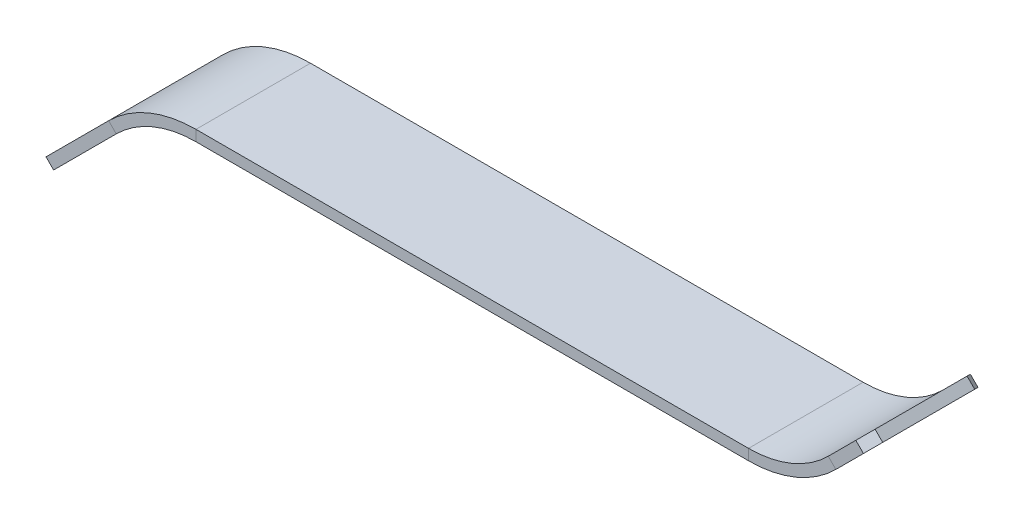
ISO-10303-21;
HEADER;
FILE_DESCRIPTION(('STEP AP214'),'2;1');
FILE_NAME('part.step','',(''),(''),'','','');
FILE_SCHEMA(('AUTOMOTIVE_DESIGN { 1 0 10303 214 1 1 1 1 }'));
ENDSEC;
DATA;
#1=APPLICATION_CONTEXT('core data for automotive mechanical design processes');
#2=APPLICATION_PROTOCOL_DEFINITION('international standard','automotive_design',2000,#1);
#3=PRODUCT_CONTEXT('',#1,'mechanical');
#4=PRODUCT('Part','Part','',(#3));
#5=PRODUCT_RELATED_PRODUCT_CATEGORY('part','',(#4));
#6=PRODUCT_DEFINITION_FORMATION('','',#4);
#7=PRODUCT_DEFINITION_CONTEXT('part definition',#1,'design');
#8=PRODUCT_DEFINITION('design','',#6,#7);
#9=PRODUCT_DEFINITION_SHAPE('','',#8);
#10=(LENGTH_UNIT() NAMED_UNIT(*) SI_UNIT(.MILLI.,.METRE.));
#11=(NAMED_UNIT(*) PLANE_ANGLE_UNIT() SI_UNIT($,.RADIAN.));
#12=(NAMED_UNIT(*) SI_UNIT($,.STERADIAN.) SOLID_ANGLE_UNIT());
#13=UNCERTAINTY_MEASURE_WITH_UNIT(LENGTH_MEASURE(1.E-05),#10,'distance_accuracy_value','');
#14=(GEOMETRIC_REPRESENTATION_CONTEXT(3) GLOBAL_UNCERTAINTY_ASSIGNED_CONTEXT((#13)) GLOBAL_UNIT_ASSIGNED_CONTEXT((#10,
#11,#12)) REPRESENTATION_CONTEXT('',''));
#15=CARTESIAN_POINT('',(0.,0.,0.));
#16=DIRECTION('',(0.,0.,1.));
#17=DIRECTION('',(1.,0.,0.));
#18=AXIS2_PLACEMENT_3D('',#15,#16,#17);
#19=CARTESIAN_POINT('',(-28.5953982311841,-40.1353390593272,-10.8));
#20=DIRECTION('',(-0.707106781186544,0.707106781186551,0.));
#21=DIRECTION('',(-0.707106781186551,-0.707106781186544,0.));
#22=AXIS2_PLACEMENT_3D('',#19,#20,#21);
#23=CYLINDRICAL_SURFACE('',#22,1.5);
#24=CARTESIAN_POINT('',(-28.5953982311841,-40.1353390593272,-10.8));
#25=DIRECTION('',(-0.707106781186544,0.707106781186551,0.));
#26=DIRECTION('',(-0.707106781186551,-0.707106781186544,0.));
#27=AXIS2_PLACEMENT_3D('',#24,#25,#26);
#28=CIRCLE('',#27,1.5);
#29=CARTESIAN_POINT('',(-29.656058402964,-41.195999231107,-10.8));
#30=VERTEX_POINT('',#29);
#31=EDGE_CURVE('E92',#30,#30,#28,.T.);
#32=ORIENTED_EDGE('',*,*,#31,.F.);
#33=EDGE_LOOP('',(#32));
#34=FACE_BOUND('',#33,.T.);
#35=CARTESIAN_POINT('',(-31.9753686452558,-36.7553686452555,-10.8));
#36=DIRECTION('',(-0.707106781186544,0.707106781186551,0.));
#37=DIRECTION('',(-0.707106781186551,-0.707106781186544,0.));
#38=AXIS2_PLACEMENT_3D('',#35,#36,#37);
#39=CIRCLE('',#38,1.5);
#40=CARTESIAN_POINT('',(-33.0360288170356,-37.8160288170353,-10.8));
#41=VERTEX_POINT('',#40);
#42=EDGE_CURVE('E13',#41,#41,#39,.T.);
#43=ORIENTED_EDGE('',*,*,#42,.T.);
#44=EDGE_LOOP('',(#43));
#45=FACE_BOUND('',#44,.T.);
#46=ADVANCED_FACE('F85',(#34,#45),#23,.F.);
#47=CARTESIAN_POINT('',(-10.9177287015203,-22.4576695296636,-10.8));
#48=DIRECTION('',(-0.707106781186544,0.707106781186551,0.));
#49=DIRECTION('',(-0.707106781186551,-0.707106781186544,0.));
#50=AXIS2_PLACEMENT_3D('',#47,#48,#49);
#51=CYLINDRICAL_SURFACE('',#50,1.5);
#52=CARTESIAN_POINT('',(-10.9177287015203,-22.4576695296636,-10.8));
#53=DIRECTION('',(-0.707106781186544,0.707106781186551,0.));
#54=DIRECTION('',(-0.707106781186551,-0.707106781186544,0.));
#55=AXIS2_PLACEMENT_3D('',#52,#53,#54);
#56=CIRCLE('',#55,1.5);
#57=CARTESIAN_POINT('',(-11.9783888733002,-23.5183297014434,-10.8));
#58=VERTEX_POINT('',#57);
#59=EDGE_CURVE('E327',#58,#58,#56,.T.);
#60=ORIENTED_EDGE('',*,*,#59,.F.);
#61=EDGE_LOOP('',(#60));
#62=FACE_BOUND('',#61,.T.);
#63=CARTESIAN_POINT('',(-14.297699115592,-19.0776991155919,-10.8));
#64=DIRECTION('',(-0.707106781186544,0.707106781186551,0.));
#65=DIRECTION('',(-0.707106781186551,-0.707106781186544,0.));
#66=AXIS2_PLACEMENT_3D('',#63,#64,#65);
#67=CIRCLE('',#66,1.5);
#68=CARTESIAN_POINT('',(-15.3583592873718,-20.1383592873717,-10.8));
#69=VERTEX_POINT('',#68);
#70=EDGE_CURVE('E330',#69,#69,#67,.T.);
#71=ORIENTED_EDGE('',*,*,#70,.T.);
#72=EDGE_LOOP('',(#71));
#73=FACE_BOUND('',#72,.T.);
#74=ADVANCED_FACE('F339',(#62,#73),#51,.F.);
#75=CARTESIAN_POINT('',(0.,-4.78,-50.8));
#76=DIRECTION('',(0.,0.,1.));
#77=DIRECTION('',(1.,0.,0.));
#78=AXIS2_PLACEMENT_3D('',#75,#76,#77);
#79=PLANE('',#78);
#80=DIRECTION('',(0.,1.,0.));
#81=VECTOR('',#80,1.);
#82=CARTESIAN_POINT('',(27.470618946798,-4.78,-50.8));
#83=LINE('',#82,#81);
#84=CARTESIAN_POINT('',(27.470618946798,-4.78,-50.8));
#85=VERTEX_POINT('',#84);
#86=CARTESIAN_POINT('',(27.470618946798,0.,-50.8));
#87=VERTEX_POINT('',#86);
#88=EDGE_CURVE('E238',#85,#87,#83,.T.);
#89=ORIENTED_EDGE('',*,*,#88,.T.);
#90=DIRECTION('',(1.,0.,0.));
#91=VECTOR('',#90,1.);
#92=CARTESIAN_POINT('',(0.,0.,-50.8));
#93=LINE('',#92,#91);
#94=CARTESIAN_POINT('',(272.529381053202,0.,-50.8));
#95=VERTEX_POINT('',#94);
#96=EDGE_CURVE('E301',#87,#95,#93,.T.);
#97=ORIENTED_EDGE('',*,*,#96,.T.);
#98=DIRECTION('',(0.,-1.,0.));
#99=VECTOR('',#98,1.);
#100=CARTESIAN_POINT('',(272.529381053202,0.,-50.8));
#101=LINE('',#100,#99);
#102=CARTESIAN_POINT('',(272.529381053202,-4.78,-50.8));
#103=VERTEX_POINT('',#102);
#104=EDGE_CURVE('E287',#95,#103,#101,.T.);
#105=ORIENTED_EDGE('',*,*,#104,.T.);
#106=DIRECTION('',(1.,0.,0.));
#107=VECTOR('',#106,1.);
#108=CARTESIAN_POINT('',(0.,-4.78,-50.8));
#109=LINE('',#108,#107);
#110=EDGE_CURVE('E304',#85,#103,#109,.T.);
#111=ORIENTED_EDGE('',*,*,#110,.F.);
#112=EDGE_LOOP('',(#89,#97,#105,#111));
#113=FACE_BOUND('',#112,.T.);
#114=ADVANCED_FACE('F420',(#113),#79,.F.);
#115=CARTESIAN_POINT('',(0.,-4.78,0.));
#116=DIRECTION('',(0.,1.,0.));
#117=DIRECTION('',(0.,0.,1.));
#118=AXIS2_PLACEMENT_3D('',#115,#116,#117);
#119=PLANE('',#118);
#120=DIRECTION('',(0.,0.,-1.));
#121=VECTOR('',#120,1.);
#122=CARTESIAN_POINT('',(27.470618946798,-4.78,-50.8));
#123=LINE('',#122,#121);
#124=CARTESIAN_POINT('',(27.470618946798,-4.78,0.));
#125=VERTEX_POINT('',#124);
#126=EDGE_CURVE('E244',#85,#125,#123,.F.);
#127=ORIENTED_EDGE('',*,*,#126,.F.);
#128=ORIENTED_EDGE('',*,*,#110,.T.);
#129=DIRECTION('',(0.,0.,-1.));
#130=VECTOR('',#129,1.);
#131=CARTESIAN_POINT('',(272.529381053202,-4.78,-50.8));
#132=LINE('',#131,#130);
#133=CARTESIAN_POINT('',(272.529381053202,-4.78,0.));
#134=VERTEX_POINT('',#133);
#135=EDGE_CURVE('E280',#103,#134,#132,.F.);
#136=ORIENTED_EDGE('',*,*,#135,.T.);
#137=DIRECTION('',(1.,0.,0.));
#138=VECTOR('',#137,1.);
#139=CARTESIAN_POINT('',(0.,-4.78,0.));
#140=LINE('',#139,#138);
#141=EDGE_CURVE('E306',#125,#134,#140,.T.);
#142=ORIENTED_EDGE('',*,*,#141,.F.);
#143=EDGE_LOOP('',(#127,#128,#136,#142));
#144=FACE_BOUND('',#143,.T.);
#145=ADVANCED_FACE('F416',(#144),#119,.F.);
#146=CARTESIAN_POINT('',(0.,0.,0.));
#147=DIRECTION('',(0.,1.,0.));
#148=DIRECTION('',(0.,0.,1.));
#149=AXIS2_PLACEMENT_3D('',#146,#147,#148);
#150=PLANE('',#149);
#151=ORIENTED_EDGE('',*,*,#96,.F.);
#152=DIRECTION('',(0.,0.,-1.));
#153=VECTOR('',#152,1.);
#154=CARTESIAN_POINT('',(27.470618946798,0.,-50.8));
#155=LINE('',#154,#153);
#156=CARTESIAN_POINT('',(27.470618946798,0.,0.));
#157=VERTEX_POINT('',#156);
#158=EDGE_CURVE('E231',#87,#157,#155,.F.);
#159=ORIENTED_EDGE('',*,*,#158,.T.);
#160=DIRECTION('',(1.,0.,0.));
#161=VECTOR('',#160,1.);
#162=CARTESIAN_POINT('',(0.,0.,0.));
#163=LINE('',#162,#161);
#164=CARTESIAN_POINT('',(272.529381053202,0.,0.));
#165=VERTEX_POINT('',#164);
#166=EDGE_CURVE('E307',#157,#165,#163,.T.);
#167=ORIENTED_EDGE('',*,*,#166,.T.);
#168=DIRECTION('',(0.,0.,-1.));
#169=VECTOR('',#168,1.);
#170=CARTESIAN_POINT('',(272.529381053202,0.,-50.8));
#171=LINE('',#170,#169);
#172=EDGE_CURVE('E293',#95,#165,#171,.F.);
#173=ORIENTED_EDGE('',*,*,#172,.F.);
#174=EDGE_LOOP('',(#151,#159,#167,#173));
#175=FACE_BOUND('',#174,.T.);
#176=ADVANCED_FACE('F419',(#175),#150,.T.);
#177=CARTESIAN_POINT('',(0.,-4.78,0.));
#178=DIRECTION('',(0.,0.,1.));
#179=DIRECTION('',(1.,0.,0.));
#180=AXIS2_PLACEMENT_3D('',#177,#178,#179);
#181=PLANE('',#180);
#182=DIRECTION('',(0.,1.,0.));
#183=VECTOR('',#182,1.);
#184=CARTESIAN_POINT('',(27.470618946798,-4.78,0.));
#185=LINE('',#184,#183);
#186=EDGE_CURVE('E249',#125,#157,#185,.T.);
#187=ORIENTED_EDGE('',*,*,#186,.F.);
#188=ORIENTED_EDGE('',*,*,#141,.T.);
#189=DIRECTION('',(0.,-1.,0.));
#190=VECTOR('',#189,1.);
#191=CARTESIAN_POINT('',(272.529381053202,0.,0.));
#192=LINE('',#191,#190);
#193=EDGE_CURVE('E298',#165,#134,#192,.T.);
#194=ORIENTED_EDGE('',*,*,#193,.F.);
#195=ORIENTED_EDGE('',*,*,#166,.F.);
#196=EDGE_LOOP('',(#187,#188,#194,#195));
#197=FACE_BOUND('',#196,.T.);
#198=ADVANCED_FACE('F411',(#197),#181,.T.);
#199=CARTESIAN_POINT('',(272.529381053202,50.,0.));
#200=DIRECTION('',(0.,0.,1.));
#201=DIRECTION('',(1.,0.,0.));
#202=AXIS2_PLACEMENT_3D('',#199,#200,#201);
#203=PLANE('',#202);
#204=DIRECTION('',(-0.707106781186544,0.707106781186551,0.));
#205=VECTOR('',#204,1.);
#206=CARTESIAN_POINT('',(311.264690526601,11.2646905266007,0.));
#207=LINE('',#206,#205);
#208=CARTESIAN_POINT('',(307.884720112529,14.6446609406724,0.));
#209=VERTEX_POINT('',#208);
#210=CARTESIAN_POINT('',(311.264690526601,11.2646905266007,0.));
#211=VERTEX_POINT('',#210);
#212=EDGE_CURVE('E252',#209,#211,#207,.F.);
#213=ORIENTED_EDGE('',*,*,#212,.F.);
#214=CARTESIAN_POINT('',(272.529381053202,50.,0.));
#215=DIRECTION('',(0.,0.,-1.));
#216=DIRECTION('',(-1.,0.,0.));
#217=AXIS2_PLACEMENT_3D('',#214,#215,#216);
#218=CIRCLE('',#217,50.);
#219=EDGE_CURVE('E290',#165,#209,#218,.F.);
#220=ORIENTED_EDGE('',*,*,#219,.F.);
#221=ORIENTED_EDGE('',*,*,#193,.T.);
#222=CARTESIAN_POINT('',(272.529381053202,50.,0.));
#223=DIRECTION('',(0.,0.,-1.));
#224=DIRECTION('',(-1.,0.,0.));
#225=AXIS2_PLACEMENT_3D('',#222,#223,#224);
#226=CIRCLE('',#225,54.78);
#227=EDGE_CURVE('E283',#134,#211,#226,.F.);
#228=ORIENTED_EDGE('',*,*,#227,.T.);
#229=EDGE_LOOP('',(#213,#220,#221,#228));
#230=FACE_BOUND('',#229,.T.);
#231=ADVANCED_FACE('F408',(#230),#203,.T.);
#232=CARTESIAN_POINT('',(272.529381053202,50.,-50.8));
#233=DIRECTION('',(0.,0.,1.));
#234=DIRECTION('',(1.,0.,0.));
#235=AXIS2_PLACEMENT_3D('',#232,#233,#234);
#236=PLANE('',#235);
#237=CARTESIAN_POINT('',(272.529381053202,50.,-50.8));
#238=DIRECTION('',(0.,0.,-1.));
#239=DIRECTION('',(-1.,0.,0.));
#240=AXIS2_PLACEMENT_3D('',#237,#238,#239);
#241=CIRCLE('',#240,50.);
#242=CARTESIAN_POINT('',(307.884720112529,14.6446609406724,-50.8));
#243=VERTEX_POINT('',#242);
#244=EDGE_CURVE('E257',#243,#95,#241,.T.);
#245=ORIENTED_EDGE('',*,*,#244,.F.);
#246=DIRECTION('',(-0.707106781186544,0.707106781186551,0.));
#247=VECTOR('',#246,1.);
#248=CARTESIAN_POINT('',(307.884720112529,14.6446609406725,-50.8));
#249=LINE('',#248,#247);
#250=CARTESIAN_POINT('',(311.264690526601,11.2646905266008,-50.8));
#251=VERTEX_POINT('',#250);
#252=EDGE_CURVE('E273',#243,#251,#249,.F.);
#253=ORIENTED_EDGE('',*,*,#252,.T.);
#254=CARTESIAN_POINT('',(272.529381053202,50.,-50.8));
#255=DIRECTION('',(0.,0.,-1.));
#256=DIRECTION('',(-1.,0.,0.));
#257=AXIS2_PLACEMENT_3D('',#254,#255,#256);
#258=CIRCLE('',#257,54.78);
#259=EDGE_CURVE('E284',#251,#103,#258,.T.);
#260=ORIENTED_EDGE('',*,*,#259,.T.);
#261=ORIENTED_EDGE('',*,*,#104,.F.);
#262=EDGE_LOOP('',(#245,#253,#260,#261));
#263=FACE_BOUND('',#262,.T.);
#264=ADVANCED_FACE('F403',(#263),#236,.F.);
#265=CARTESIAN_POINT('',(272.529381053202,50.,-50.8));
#266=DIRECTION('',(0.,0.,-1.));
#267=DIRECTION('',(0.707106781186544,-0.707106781186551,0.));
#268=AXIS2_PLACEMENT_3D('',#265,#266,#267);
#269=CYLINDRICAL_SURFACE('',#268,54.78);
#270=ORIENTED_EDGE('',*,*,#135,.F.);
#271=ORIENTED_EDGE('',*,*,#259,.F.);
#272=DIRECTION('',(0.,0.,-1.));
#273=VECTOR('',#272,1.);
#274=CARTESIAN_POINT('',(311.264690526601,11.2646905266008,0.));
#275=LINE('',#274,#273);
#276=EDGE_CURVE('E270',#251,#211,#275,.F.);
#277=ORIENTED_EDGE('',*,*,#276,.T.);
#278=ORIENTED_EDGE('',*,*,#227,.F.);
#279=EDGE_LOOP('',(#270,#271,#277,#278));
#280=FACE_BOUND('',#279,.T.);
#281=ADVANCED_FACE('F400',(#280),#269,.T.);
#282=CARTESIAN_POINT('',(272.529381053202,50.,-50.8));
#283=DIRECTION('',(0.,0.,-1.));
#284=DIRECTION('',(0.707106781186544,-0.707106781186551,0.));
#285=AXIS2_PLACEMENT_3D('',#282,#283,#284);
#286=CYLINDRICAL_SURFACE('',#285,50.);
#287=ORIENTED_EDGE('',*,*,#172,.T.);
#288=ORIENTED_EDGE('',*,*,#219,.T.);
#289=DIRECTION('',(0.,0.,-1.));
#290=VECTOR('',#289,1.);
#291=CARTESIAN_POINT('',(307.884720112529,14.6446609406725,0.));
#292=LINE('',#291,#290);
#293=EDGE_CURVE('E276',#209,#243,#292,.T.);
#294=ORIENTED_EDGE('',*,*,#293,.T.);
#295=ORIENTED_EDGE('',*,*,#244,.T.);
#296=EDGE_LOOP('',(#287,#288,#294,#295));
#297=FACE_BOUND('',#296,.T.);
#298=ADVANCED_FACE('F398',(#297),#286,.F.);
#299=CARTESIAN_POINT('',(296.620029585928,-3.37997041407172,0.));
#300=DIRECTION('',(0.,0.,-1.));
#301=DIRECTION('',(-1.,0.,0.));
#302=AXIS2_PLACEMENT_3D('',#299,#300,#301);
#303=PLANE('',#302);
#304=DIRECTION('',(-0.707106781186551,-0.707106781186544,0.));
#305=VECTOR('',#304,1.);
#306=CARTESIAN_POINT('',(146.620029585927,-153.379970414072,0.));
#307=LINE('',#306,#305);
#308=CARTESIAN_POINT('',(323.504271247462,23.5042712474618,0.));
#309=VERTEX_POINT('',#308);
#310=EDGE_CURVE('E261',#309,#211,#307,.T.);
#311=ORIENTED_EDGE('',*,*,#310,.F.);
#312=DIRECTION('',(-0.707106781186544,0.707106781186551,0.));
#313=VECTOR('',#312,1.);
#314=CARTESIAN_POINT('',(323.504271247462,23.5042712474617,0.));
#315=LINE('',#314,#313);
#316=CARTESIAN_POINT('',(320.12430083339,26.8842416615334,0.));
#317=VERTEX_POINT('',#316);
#318=EDGE_CURVE('E320',#309,#317,#315,.T.);
#319=ORIENTED_EDGE('',*,*,#318,.T.);
#320=DIRECTION('',(0.707106781186551,0.707106781186544,0.));
#321=VECTOR('',#320,1.);
#322=CARTESIAN_POINT('',(293.240059171857,0.,0.));
#323=LINE('',#322,#321);
#324=EDGE_CURVE('E268',#317,#209,#323,.F.);
#325=ORIENTED_EDGE('',*,*,#324,.T.);
#326=ORIENTED_EDGE('',*,*,#212,.T.);
#327=EDGE_LOOP('',(#311,#319,#325,#326));
#328=FACE_BOUND('',#327,.T.);
#329=ADVANCED_FACE('F394',(#328),#303,.F.);
#330=CARTESIAN_POINT('',(327.039805153395,27.0398051533945,-50.8));
#331=DIRECTION('',(0.,0.,1.));
#332=DIRECTION('',(1.,0.,0.));
#333=AXIS2_PLACEMENT_3D('',#330,#331,#332);
#334=PLANE('',#333);
#335=DIRECTION('',(-0.707106781186551,-0.707106781186544,0.));
#336=VECTOR('',#335,1.);
#337=CARTESIAN_POINT('',(323.659834739323,30.4197755674662,-50.8));
#338=LINE('',#337,#336);
#339=CARTESIAN_POINT('',(320.12430083339,26.8842416615335,-50.8));
#340=VERTEX_POINT('',#339);
#341=EDGE_CURVE('E265',#243,#340,#338,.F.);
#342=ORIENTED_EDGE('',*,*,#341,.T.);
#343=DIRECTION('',(0.707106781186544,-0.707106781186551,0.));
#344=VECTOR('',#343,1.);
#345=CARTESIAN_POINT('',(323.504271247462,23.5042712474617,-50.8));
#346=LINE('',#345,#344);
#347=CARTESIAN_POINT('',(323.504271247462,23.5042712474617,-50.8));
#348=VERTEX_POINT('',#347);
#349=EDGE_CURVE('E316',#340,#348,#346,.T.);
#350=ORIENTED_EDGE('',*,*,#349,.T.);
#351=DIRECTION('',(0.707106781186551,0.707106781186544,0.));
#352=VECTOR('',#351,1.);
#353=CARTESIAN_POINT('',(146.620029585927,-153.379970414072,-50.8));
#354=LINE('',#353,#352);
#355=EDGE_CURVE('E258',#251,#348,#354,.T.);
#356=ORIENTED_EDGE('',*,*,#355,.F.);
#357=ORIENTED_EDGE('',*,*,#252,.F.);
#358=EDGE_LOOP('',(#342,#350,#356,#357));
#359=FACE_BOUND('',#358,.T.);
#360=ADVANCED_FACE('F386',(#359),#334,.F.);
#361=CARTESIAN_POINT('',(146.620029585927,-153.379970414072,0.));
#362=DIRECTION('',(-0.707106781186544,0.707106781186551,0.));
#363=DIRECTION('',(-0.707106781186551,-0.707106781186544,0.));
#364=AXIS2_PLACEMENT_3D('',#361,#362,#363);
#365=PLANE('',#364);
#366=DIRECTION('',(0.,0.,1.));
#367=VECTOR('',#366,1.);
#368=CARTESIAN_POINT('',(327.039805153395,27.0398051533945,0.));
#369=LINE('',#368,#367);
#370=CARTESIAN_POINT('',(327.039805153395,27.0398051533945,-45.8));
#371=VERTEX_POINT('',#370);
#372=CARTESIAN_POINT('',(327.039805153395,27.0398051533945,-5.00000000000003));
#373=VERTEX_POINT('',#372);
#374=EDGE_CURVE('E255',#371,#373,#369,.T.);
#375=ORIENTED_EDGE('',*,*,#374,.T.);
#376=DIRECTION('',(0.500000000000004,0.499999999999999,-0.707106781186545));
#377=VECTOR('',#376,1.);
#378=CARTESIAN_POINT('',(323.504271247462,23.5042712474617,0.));
#379=LINE('',#378,#377);
#380=EDGE_CURVE('E325',#373,#309,#379,.F.);
#381=ORIENTED_EDGE('',*,*,#380,.T.);
#382=ORIENTED_EDGE('',*,*,#310,.T.);
#383=ORIENTED_EDGE('',*,*,#276,.F.);
#384=ORIENTED_EDGE('',*,*,#355,.T.);
#385=DIRECTION('',(-0.500000000000004,-0.499999999999999,-0.707106781186546));
#386=VECTOR('',#385,1.);
#387=CARTESIAN_POINT('',(327.039805153395,27.0398051533945,-45.8));
#388=LINE('',#387,#386);
#389=EDGE_CURVE('E318',#348,#371,#388,.F.);
#390=ORIENTED_EDGE('',*,*,#389,.T.);
#391=EDGE_LOOP('',(#375,#381,#382,#383,#384,#390));
#392=FACE_BOUND('',#391,.T.);
#393=ADVANCED_FACE('F382',(#392),#365,.F.);
#394=CARTESIAN_POINT('',(143.240059171855,-150.,0.));
#395=DIRECTION('',(-0.707106781186544,0.707106781186551,0.));
#396=DIRECTION('',(-0.707106781186551,-0.707106781186544,0.));
#397=AXIS2_PLACEMENT_3D('',#394,#395,#396);
#398=PLANE('',#397);
#399=ORIENTED_EDGE('',*,*,#324,.F.);
#400=DIRECTION('',(-0.500000000000004,-0.499999999999999,0.707106781186545));
#401=VECTOR('',#400,1.);
#402=CARTESIAN_POINT('',(231.682180002622,-61.5578791692339,125.076046763911));
#403=LINE('',#402,#401);
#404=CARTESIAN_POINT('',(323.659834739323,30.4197755674662,-5.00000000000003));
#405=VERTEX_POINT('',#404);
#406=EDGE_CURVE('E107',#317,#405,#403,.F.);
#407=ORIENTED_EDGE('',*,*,#406,.T.);
#408=DIRECTION('',(0.,0.,-1.));
#409=VECTOR('',#408,1.);
#410=CARTESIAN_POINT('',(323.659834739323,30.4197755674662,0.));
#411=LINE('',#410,#409);
#412=CARTESIAN_POINT('',(323.659834739323,30.4197755674662,-45.8));
#413=VERTEX_POINT('',#412);
#414=EDGE_CURVE('E263',#413,#405,#411,.F.);
#415=ORIENTED_EDGE('',*,*,#414,.F.);
#416=DIRECTION('',(0.500000000000004,0.499999999999999,0.707106781186546));
#417=VECTOR('',#416,1.);
#418=CARTESIAN_POINT('',(249.642692244761,-43.5973669270955,-150.476046763911));
#419=LINE('',#418,#417);
#420=EDGE_CURVE('E314',#413,#340,#419,.F.);
#421=ORIENTED_EDGE('',*,*,#420,.T.);
#422=ORIENTED_EDGE('',*,*,#341,.F.);
#423=ORIENTED_EDGE('',*,*,#293,.F.);
#424=EDGE_LOOP('',(#399,#407,#415,#421,#422,#423));
#425=FACE_BOUND('',#424,.T.);
#426=ADVANCED_FACE('F385',(#425),#398,.T.);
#427=CARTESIAN_POINT('',(327.039805153395,27.0398051533945,0.));
#428=DIRECTION('',(-0.707106781186551,-0.707106781186544,0.));
#429=DIRECTION('',(0.707106781186544,-0.707106781186551,0.));
#430=AXIS2_PLACEMENT_3D('',#427,#428,#429);
#431=PLANE('',#430);
#432=ORIENTED_EDGE('',*,*,#414,.T.);
#433=DIRECTION('',(0.707106781186544,-0.707106781186551,0.));
#434=VECTOR('',#433,1.);
#435=CARTESIAN_POINT('',(327.039805153395,27.0398051533945,-5.00000000000003));
#436=LINE('',#435,#434);
#437=EDGE_CURVE('E99',#405,#373,#436,.T.);
#438=ORIENTED_EDGE('',*,*,#437,.T.);
#439=ORIENTED_EDGE('',*,*,#374,.F.);
#440=DIRECTION('',(-0.707106781186544,0.707106781186551,0.));
#441=VECTOR('',#440,1.);
#442=CARTESIAN_POINT('',(327.039805153395,27.0398051533945,-45.8));
#443=LINE('',#442,#441);
#444=EDGE_CURVE('E309',#371,#413,#443,.T.);
#445=ORIENTED_EDGE('',*,*,#444,.T.);
#446=EDGE_LOOP('',(#432,#438,#439,#445));
#447=FACE_BOUND('',#446,.T.);
#448=ADVANCED_FACE('F377',(#447),#431,.F.);
#449=CARTESIAN_POINT('',(27.470618946798,-54.78,0.));
#450=DIRECTION('',(0.,0.,1.));
#451=DIRECTION('',(1.,0.,0.));
#452=AXIS2_PLACEMENT_3D('',#449,#450,#451);
#453=PLANE('',#452);
#454=DIRECTION('',(0.707106781186544,-0.707106781186551,0.));
#455=VECTOR('',#454,1.);
#456=CARTESIAN_POINT('',(-11.2646905266008,-16.0446905266007,0.));
#457=LINE('',#456,#455);
#458=CARTESIAN_POINT('',(-7.88472011252916,-19.4246609406724,0.));
#459=VERTEX_POINT('',#458);
#460=CARTESIAN_POINT('',(-11.2646905266008,-16.0446905266007,0.));
#461=VERTEX_POINT('',#460);
#462=EDGE_CURVE('E212',#459,#461,#457,.F.);
#463=ORIENTED_EDGE('',*,*,#462,.F.);
#464=CARTESIAN_POINT('',(27.470618946798,-54.78,0.));
#465=DIRECTION('',(0.,0.,-1.));
#466=DIRECTION('',(-1.,0.,0.));
#467=AXIS2_PLACEMENT_3D('',#464,#465,#466);
#468=CIRCLE('',#467,50.);
#469=EDGE_CURVE('E241',#125,#459,#468,.F.);
#470=ORIENTED_EDGE('',*,*,#469,.F.);
#471=ORIENTED_EDGE('',*,*,#186,.T.);
#472=CARTESIAN_POINT('',(27.470618946798,-54.78,0.));
#473=DIRECTION('',(0.,0.,-1.));
#474=DIRECTION('',(-1.,0.,0.));
#475=AXIS2_PLACEMENT_3D('',#472,#473,#474);
#476=CIRCLE('',#475,54.78);
#477=EDGE_CURVE('E234',#157,#461,#476,.F.);
#478=ORIENTED_EDGE('',*,*,#477,.T.);
#479=EDGE_LOOP('',(#463,#470,#471,#478));
#480=FACE_BOUND('',#479,.T.);
#481=ADVANCED_FACE('F374',(#480),#453,.T.);
#482=CARTESIAN_POINT('',(27.470618946798,-54.78,-50.8));
#483=DIRECTION('',(0.,0.,1.));
#484=DIRECTION('',(1.,0.,0.));
#485=AXIS2_PLACEMENT_3D('',#482,#483,#484);
#486=PLANE('',#485);
#487=CARTESIAN_POINT('',(27.470618946798,-54.78,-50.8));
#488=DIRECTION('',(0.,0.,-1.));
#489=DIRECTION('',(-1.,0.,0.));
#490=AXIS2_PLACEMENT_3D('',#487,#488,#489);
#491=CIRCLE('',#490,50.);
#492=CARTESIAN_POINT('',(-7.88472011252916,-19.4246609406724,-50.8));
#493=VERTEX_POINT('',#492);
#494=EDGE_CURVE('E246',#493,#85,#491,.T.);
#495=ORIENTED_EDGE('',*,*,#494,.F.);
#496=DIRECTION('',(0.707106781186544,-0.707106781186551,0.));
#497=VECTOR('',#496,1.);
#498=CARTESIAN_POINT('',(-7.88472011252916,-19.4246609406724,-50.8));
#499=LINE('',#498,#497);
#500=CARTESIAN_POINT('',(-11.2646905266008,-16.0446905266007,-50.8));
#501=VERTEX_POINT('',#500);
#502=EDGE_CURVE('E224',#493,#501,#499,.F.);
#503=ORIENTED_EDGE('',*,*,#502,.T.);
#504=CARTESIAN_POINT('',(27.470618946798,-54.78,-50.8));
#505=DIRECTION('',(0.,0.,-1.));
#506=DIRECTION('',(-1.,0.,0.));
#507=AXIS2_PLACEMENT_3D('',#504,#505,#506);
#508=CIRCLE('',#507,54.78);
#509=EDGE_CURVE('E235',#501,#87,#508,.T.);
#510=ORIENTED_EDGE('',*,*,#509,.T.);
#511=ORIENTED_EDGE('',*,*,#88,.F.);
#512=EDGE_LOOP('',(#495,#503,#510,#511));
#513=FACE_BOUND('',#512,.T.);
#514=ADVANCED_FACE('F369',(#513),#486,.F.);
#515=CARTESIAN_POINT('',(27.470618946798,-54.78,-50.8));
#516=DIRECTION('',(0.,0.,-1.));
#517=DIRECTION('',(-0.707106781186544,0.707106781186551,0.));
#518=AXIS2_PLACEMENT_3D('',#515,#516,#517);
#519=CYLINDRICAL_SURFACE('',#518,54.78);
#520=ORIENTED_EDGE('',*,*,#158,.F.);
#521=ORIENTED_EDGE('',*,*,#509,.F.);
#522=DIRECTION('',(0.,0.,-1.));
#523=VECTOR('',#522,1.);
#524=CARTESIAN_POINT('',(-11.2646905266008,-16.0446905266007,0.));
#525=LINE('',#524,#523);
#526=EDGE_CURVE('E222',#501,#461,#525,.F.);
#527=ORIENTED_EDGE('',*,*,#526,.T.);
#528=ORIENTED_EDGE('',*,*,#477,.F.);
#529=EDGE_LOOP('',(#520,#521,#527,#528));
#530=FACE_BOUND('',#529,.T.);
#531=ADVANCED_FACE('F366',(#530),#519,.T.);
#532=CARTESIAN_POINT('',(27.470618946798,-54.78,-50.8));
#533=DIRECTION('',(0.,0.,-1.));
#534=DIRECTION('',(-0.707106781186544,0.707106781186551,0.));
#535=AXIS2_PLACEMENT_3D('',#532,#533,#534);
#536=CYLINDRICAL_SURFACE('',#535,50.);
#537=ORIENTED_EDGE('',*,*,#126,.T.);
#538=ORIENTED_EDGE('',*,*,#469,.T.);
#539=DIRECTION('',(0.,0.,-1.));
#540=VECTOR('',#539,1.);
#541=CARTESIAN_POINT('',(-7.88472011252916,-19.4246609406724,0.));
#542=LINE('',#541,#540);
#543=EDGE_CURVE('E227',#459,#493,#542,.T.);
#544=ORIENTED_EDGE('',*,*,#543,.T.);
#545=ORIENTED_EDGE('',*,*,#494,.T.);
#546=EDGE_LOOP('',(#537,#538,#544,#545));
#547=FACE_BOUND('',#546,.T.);
#548=ADVANCED_FACE('F364',(#547),#536,.F.);
#549=CARTESIAN_POINT('',(-39.0464364571213,-43.8264364571209,-50.8));
#550=DIRECTION('',(0.,0.,1.));
#551=DIRECTION('',(1.,0.,0.));
#552=AXIS2_PLACEMENT_3D('',#549,#550,#551);
#553=PLANE('',#552);
#554=ORIENTED_EDGE('',*,*,#502,.F.);
#555=DIRECTION('',(0.707106781186551,0.707106781186544,0.));
#556=VECTOR('',#555,1.);
#557=CARTESIAN_POINT('',(-35.6664660430496,-47.2064068711926,-50.8));
#558=LINE('',#557,#556);
#559=CARTESIAN_POINT('',(-35.6664660430496,-47.2064068711926,-50.8));
#560=VERTEX_POINT('',#559);
#561=EDGE_CURVE('E220',#493,#560,#558,.F.);
#562=ORIENTED_EDGE('',*,*,#561,.T.);
#563=DIRECTION('',(0.707106781186544,-0.707106781186551,0.));
#564=VECTOR('',#563,1.);
#565=CARTESIAN_POINT('',(-39.0464364571213,-43.8264364571209,-50.8));
#566=LINE('',#565,#564);
#567=CARTESIAN_POINT('',(-39.0464364571213,-43.8264364571209,-50.8));
#568=VERTEX_POINT('',#567);
#569=EDGE_CURVE('E208',#568,#560,#566,.T.);
#570=ORIENTED_EDGE('',*,*,#569,.F.);
#571=DIRECTION('',(-0.707106781186551,-0.707106781186544,0.));
#572=VECTOR('',#571,1.);
#573=CARTESIAN_POINT('',(5.76997041407175,0.989970414071686,-50.8));
#574=LINE('',#573,#572);
#575=EDGE_CURVE('E195',#501,#568,#574,.T.);
#576=ORIENTED_EDGE('',*,*,#575,.F.);
#577=EDGE_LOOP('',(#554,#562,#570,#576));
#578=FACE_BOUND('',#577,.T.);
#579=ADVANCED_FACE('F351',(#578),#553,.F.);
#580=CARTESIAN_POINT('',(3.37997041407175,-1.40002958592829,0.));
#581=DIRECTION('',(0.,0.,-1.));
#582=DIRECTION('',(-1.,0.,0.));
#583=AXIS2_PLACEMENT_3D('',#580,#581,#582);
#584=PLANE('',#583);
#585=ORIENTED_EDGE('',*,*,#462,.T.);
#586=DIRECTION('',(0.707106781186551,0.707106781186544,0.));
#587=VECTOR('',#586,1.);
#588=CARTESIAN_POINT('',(5.76997041407175,0.98997041407169,0.));
#589=LINE('',#588,#587);
#590=CARTESIAN_POINT('',(-39.0464364571213,-43.8264364571209,0.));
#591=VERTEX_POINT('',#590);
#592=EDGE_CURVE('E193',#591,#461,#589,.T.);
#593=ORIENTED_EDGE('',*,*,#592,.F.);
#594=DIRECTION('',(0.707106781186544,-0.707106781186551,0.));
#595=VECTOR('',#594,1.);
#596=CARTESIAN_POINT('',(-39.0464364571213,-43.8264364571209,0.));
#597=LINE('',#596,#595);
#598=CARTESIAN_POINT('',(-35.6664660430497,-47.2064068711926,0.));
#599=VERTEX_POINT('',#598);
#600=EDGE_CURVE('E201',#591,#599,#597,.T.);
#601=ORIENTED_EDGE('',*,*,#600,.T.);
#602=DIRECTION('',(-0.707106781186551,-0.707106781186544,0.));
#603=VECTOR('',#602,1.);
#604=CARTESIAN_POINT('',(6.75994082814343,-4.78,0.));
#605=LINE('',#604,#603);
#606=EDGE_CURVE('E217',#599,#459,#605,.F.);
#607=ORIENTED_EDGE('',*,*,#606,.T.);
#608=EDGE_LOOP('',(#585,#593,#601,#607));
#609=FACE_BOUND('',#608,.T.);
#610=ADVANCED_FACE('F211',(#609),#584,.F.);
#611=CARTESIAN_POINT('',(5.76997041407175,0.98997041407169,0.));
#612=DIRECTION('',(0.707106781186544,-0.707106781186551,0.));
#613=DIRECTION('',(0.707106781186551,0.707106781186544,0.));
#614=AXIS2_PLACEMENT_3D('',#611,#612,#613);
#615=PLANE('',#614);
#616=CARTESIAN_POINT('',(-31.9753686452558,-36.7553686452555,-40.8));
#617=DIRECTION('',(-0.707106781186544,0.707106781186551,0.));
#618=DIRECTION('',(-0.707106781186551,-0.707106781186544,0.));
#619=AXIS2_PLACEMENT_3D('',#616,#617,#618);
#620=CIRCLE('',#619,1.5);
#621=CARTESIAN_POINT('',(-33.0360288170356,-37.8160288170353,-40.8));
#622=VERTEX_POINT('',#621);
#623=EDGE_CURVE('E705',#622,#622,#620,.T.);
#624=ORIENTED_EDGE('',*,*,#623,.F.);
#625=EDGE_LOOP('',(#624));
#626=FACE_BOUND('',#625,.T.);
#627=CARTESIAN_POINT('',(-14.297699115592,-19.0776991155919,-40.8));
#628=DIRECTION('',(-0.707106781186544,0.707106781186551,0.));
#629=DIRECTION('',(-0.707106781186551,-0.707106781186544,0.));
#630=AXIS2_PLACEMENT_3D('',#627,#628,#629);
#631=CIRCLE('',#630,1.5);
#632=CARTESIAN_POINT('',(-15.3583592873718,-20.1383592873717,-40.8));
#633=VERTEX_POINT('',#632);
#634=EDGE_CURVE('E706',#633,#633,#631,.T.);
#635=ORIENTED_EDGE('',*,*,#634,.F.);
#636=EDGE_LOOP('',(#635));
#637=FACE_BOUND('',#636,.T.);
#638=ORIENTED_EDGE('',*,*,#526,.F.);
#639=ORIENTED_EDGE('',*,*,#575,.T.);
#640=DIRECTION('',(0.,0.,1.));
#641=VECTOR('',#640,1.);
#642=CARTESIAN_POINT('',(-39.0464364571213,-43.8264364571209,0.));
#643=LINE('',#642,#641);
#644=EDGE_CURVE('E187',#568,#591,#643,.T.);
#645=ORIENTED_EDGE('',*,*,#644,.T.);
#646=ORIENTED_EDGE('',*,*,#592,.T.);
#647=EDGE_LOOP('',(#638,#639,#645,#646));
#648=FACE_BOUND('',#647,.T.);
#649=ORIENTED_EDGE('',*,*,#70,.F.);
#650=EDGE_LOOP('',(#649));
#651=FACE_BOUND('',#650,.T.);
#652=ORIENTED_EDGE('',*,*,#42,.F.);
#653=EDGE_LOOP('',(#652));
#654=FACE_BOUND('',#653,.T.);
#655=ADVANCED_FACE('F190',(#626,#637,#648,#651,#654),#615,.F.);
#656=CARTESIAN_POINT('',(9.14994082814343,-2.39000000000003,0.));
#657=DIRECTION('',(0.707106781186544,-0.707106781186551,0.));
#658=DIRECTION('',(0.707106781186551,0.707106781186544,0.));
#659=AXIS2_PLACEMENT_3D('',#656,#657,#658);
#660=PLANE('',#659);
#661=CARTESIAN_POINT('',(-28.5953982311841,-40.1353390593272,-40.8));
#662=DIRECTION('',(-0.707106781186544,0.707106781186551,0.));
#663=DIRECTION('',(-0.707106781186551,-0.707106781186544,0.));
#664=AXIS2_PLACEMENT_3D('',#661,#662,#663);
#665=CIRCLE('',#664,1.5);
#666=CARTESIAN_POINT('',(-29.656058402964,-41.195999231107,-40.8));
#667=VERTEX_POINT('',#666);
#668=EDGE_CURVE('E703',#667,#667,#665,.T.);
#669=ORIENTED_EDGE('',*,*,#668,.T.);
#670=EDGE_LOOP('',(#669));
#671=FACE_BOUND('',#670,.T.);
#672=CARTESIAN_POINT('',(-10.9177287015203,-22.4576695296636,-40.8));
#673=DIRECTION('',(-0.707106781186544,0.707106781186551,0.));
#674=DIRECTION('',(-0.707106781186551,-0.707106781186544,0.));
#675=AXIS2_PLACEMENT_3D('',#672,#673,#674);
#676=CIRCLE('',#675,1.5);
#677=CARTESIAN_POINT('',(-11.9783888733002,-23.5183297014434,-40.8));
#678=VERTEX_POINT('',#677);
#679=EDGE_CURVE('E230',#678,#678,#676,.T.);
#680=ORIENTED_EDGE('',*,*,#679,.T.);
#681=EDGE_LOOP('',(#680));
#682=FACE_BOUND('',#681,.T.);
#683=ORIENTED_EDGE('',*,*,#561,.F.);
#684=ORIENTED_EDGE('',*,*,#543,.F.);
#685=ORIENTED_EDGE('',*,*,#606,.F.);
#686=DIRECTION('',(0.,0.,-1.));
#687=VECTOR('',#686,1.);
#688=CARTESIAN_POINT('',(-35.6664660430496,-47.2064068711926,0.));
#689=LINE('',#688,#687);
#690=EDGE_CURVE('E204',#560,#599,#689,.F.);
#691=ORIENTED_EDGE('',*,*,#690,.F.);
#692=EDGE_LOOP('',(#683,#684,#685,#691));
#693=FACE_BOUND('',#692,.T.);
#694=ORIENTED_EDGE('',*,*,#59,.T.);
#695=EDGE_LOOP('',(#694));
#696=FACE_BOUND('',#695,.T.);
#697=ORIENTED_EDGE('',*,*,#31,.T.);
#698=EDGE_LOOP('',(#697));
#699=FACE_BOUND('',#698,.T.);
#700=ADVANCED_FACE('F335',(#671,#682,#693,#696,#699),#660,.T.);
#701=CARTESIAN_POINT('',(-39.0464364571213,-43.8264364571209,0.));
#702=DIRECTION('',(0.707106781186551,0.707106781186544,0.));
#703=DIRECTION('',(-0.707106781186544,0.707106781186551,0.));
#704=AXIS2_PLACEMENT_3D('',#701,#702,#703);
#705=PLANE('',#704);
#706=ORIENTED_EDGE('',*,*,#690,.T.);
#707=ORIENTED_EDGE('',*,*,#600,.F.);
#708=ORIENTED_EDGE('',*,*,#644,.F.);
#709=ORIENTED_EDGE('',*,*,#569,.T.);
#710=EDGE_LOOP('',(#706,#707,#708,#709));
#711=FACE_BOUND('',#710,.T.);
#712=ADVANCED_FACE('F202',(#711),#705,.F.);
#713=CARTESIAN_POINT('',(327.039805153395,27.0398051533945,-45.8));
#714=DIRECTION('',(-0.500000000000001,-0.499999999999996,0.707106781186549));
#715=DIRECTION('',(-0.707106781186544,0.707106781186551,0.));
#716=AXIS2_PLACEMENT_3D('',#713,#714,#715);
#717=PLANE('',#716);
#718=ORIENTED_EDGE('',*,*,#389,.F.);
#719=ORIENTED_EDGE('',*,*,#349,.F.);
#720=ORIENTED_EDGE('',*,*,#420,.F.);
#721=ORIENTED_EDGE('',*,*,#444,.F.);
#722=EDGE_LOOP('',(#718,#719,#720,#721));
#723=FACE_BOUND('',#722,.T.);
#724=ADVANCED_FACE('F361',(#723),#717,.F.);
#725=CARTESIAN_POINT('',(323.504271247462,23.5042712474617,0.));
#726=DIRECTION('',(-0.500000000000001,-0.499999999999996,-0.70710678118655));
#727=DIRECTION('',(-0.707106781186544,0.707106781186551,0.));
#728=AXIS2_PLACEMENT_3D('',#725,#726,#727);
#729=PLANE('',#728);
#730=ORIENTED_EDGE('',*,*,#380,.F.);
#731=ORIENTED_EDGE('',*,*,#437,.F.);
#732=ORIENTED_EDGE('',*,*,#406,.F.);
#733=ORIENTED_EDGE('',*,*,#318,.F.);
#734=EDGE_LOOP('',(#730,#731,#732,#733));
#735=FACE_BOUND('',#734,.T.);
#736=ADVANCED_FACE('F437',(#735),#729,.F.);
#737=CARTESIAN_POINT('',(-10.9177287015203,-22.4576695296636,-40.8));
#738=DIRECTION('',(-0.707106781186544,0.707106781186551,0.));
#739=DIRECTION('',(-0.707106781186551,-0.707106781186544,0.));
#740=AXIS2_PLACEMENT_3D('',#737,#738,#739);
#741=CYLINDRICAL_SURFACE('',#740,1.5);
#742=ORIENTED_EDGE('',*,*,#679,.F.);
#743=EDGE_LOOP('',(#742));
#744=FACE_BOUND('',#743,.T.);
#745=ORIENTED_EDGE('',*,*,#634,.T.);
#746=EDGE_LOOP('',(#745));
#747=FACE_BOUND('',#746,.T.);
#748=ADVANCED_FACE('F356',(#744,#747),#741,.F.);
#749=CARTESIAN_POINT('',(-28.5953982311841,-40.1353390593272,-40.8));
#750=DIRECTION('',(-0.707106781186544,0.707106781186551,0.));
#751=DIRECTION('',(-0.707106781186551,-0.707106781186544,0.));
#752=AXIS2_PLACEMENT_3D('',#749,#750,#751);
#753=CYLINDRICAL_SURFACE('',#752,1.5);
#754=ORIENTED_EDGE('',*,*,#668,.F.);
#755=EDGE_LOOP('',(#754));
#756=FACE_BOUND('',#755,.T.);
#757=ORIENTED_EDGE('',*,*,#623,.T.);
#758=EDGE_LOOP('',(#757));
#759=FACE_BOUND('',#758,.T.);
#760=ADVANCED_FACE('F556',(#756,#759),#753,.F.);
#761=CLOSED_SHELL('',(#46,#74,#114,#145,#176,#198,#231,#264,#281,#298,#329,#360,#393,#426,#448,
#481,#514,#531,#548,#579,#610,#655,#700,#712,#724,#736,#748,#760));
#762=MANIFOLD_SOLID_BREP('B2',#761);
#763=ADVANCED_BREP_SHAPE_REPRESENTATION('',(#18,#762),#14);
#764=SHAPE_DEFINITION_REPRESENTATION(#9,#763);
ENDSEC;
END-ISO-10303-21;
